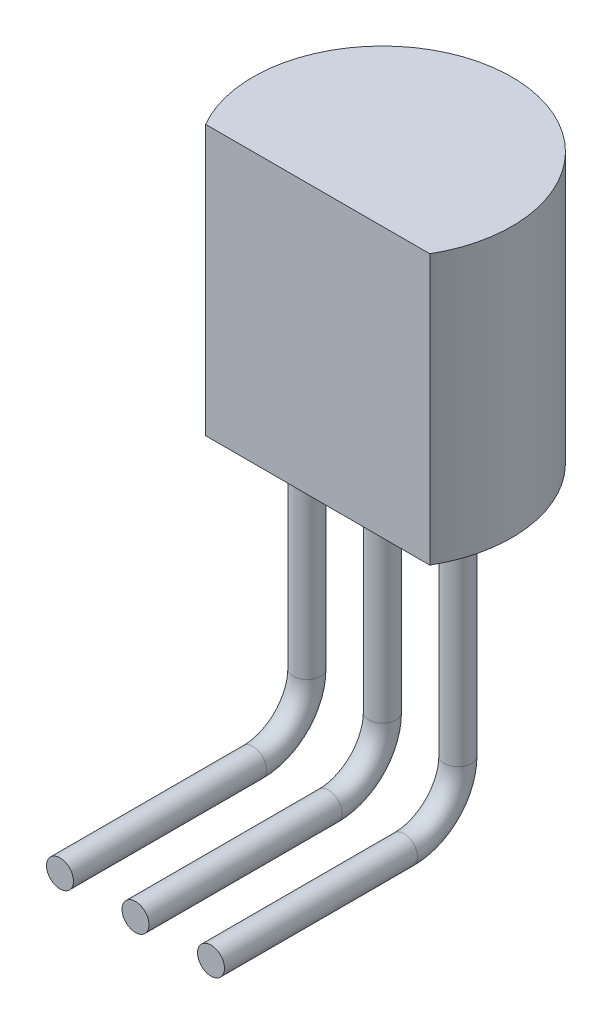
ISO-10303-21;
HEADER;
FILE_DESCRIPTION(('STEP AP214'),'2;1');
FILE_NAME('part.step','',(''),(''),'','','');
FILE_SCHEMA(('AUTOMOTIVE_DESIGN { 1 0 10303 214 1 1 1 1 }'));
ENDSEC;
DATA;
#1=APPLICATION_CONTEXT('core data for automotive mechanical design processes');
#2=APPLICATION_PROTOCOL_DEFINITION('international standard','automotive_design',2000,#1);
#3=PRODUCT_CONTEXT('',#1,'mechanical');
#4=PRODUCT('Part','Part','',(#3));
#5=PRODUCT_RELATED_PRODUCT_CATEGORY('part','',(#4));
#6=PRODUCT_DEFINITION_FORMATION('','',#4);
#7=PRODUCT_DEFINITION_CONTEXT('part definition',#1,'design');
#8=PRODUCT_DEFINITION('design','',#6,#7);
#9=PRODUCT_DEFINITION_SHAPE('','',#8);
#10=(LENGTH_UNIT() NAMED_UNIT(*) SI_UNIT(.MILLI.,.METRE.));
#11=(NAMED_UNIT(*) PLANE_ANGLE_UNIT() SI_UNIT($,.RADIAN.));
#12=(NAMED_UNIT(*) SI_UNIT($,.STERADIAN.) SOLID_ANGLE_UNIT());
#13=UNCERTAINTY_MEASURE_WITH_UNIT(LENGTH_MEASURE(1.E-05),#10,'distance_accuracy_value','');
#14=(GEOMETRIC_REPRESENTATION_CONTEXT(3) GLOBAL_UNCERTAINTY_ASSIGNED_CONTEXT((#13)) GLOBAL_UNIT_ASSIGNED_CONTEXT((#10,
#11,#12)) REPRESENTATION_CONTEXT('',''));
#15=CARTESIAN_POINT('',(0.,0.,0.));
#16=DIRECTION('',(0.,0.,1.));
#17=DIRECTION('',(1.,0.,0.));
#18=AXIS2_PLACEMENT_3D('',#15,#16,#17);
#19=CARTESIAN_POINT('',(0.,0.,0.));
#20=DIRECTION('',(0.,1.,0.));
#21=DIRECTION('',(0.,0.,1.));
#22=AXIS2_PLACEMENT_3D('',#19,#20,#21);
#23=PLANE('',#22);
#24=CARTESIAN_POINT('',(1.4,0.,0.));
#25=DIRECTION('',(0.,-1.,0.));
#26=DIRECTION('',(0.,0.,-1.));
#27=AXIS2_PLACEMENT_3D('',#24,#25,#26);
#28=CIRCLE('',#27,0.25);
#29=CARTESIAN_POINT('',(1.4,0.,-0.250000000000001));
#30=VERTEX_POINT('',#29);
#31=EDGE_CURVE('E41',#30,#30,#28,.T.);
#32=ORIENTED_EDGE('',*,*,#31,.F.);
#33=EDGE_LOOP('',(#32));
#34=FACE_BOUND('',#33,.T.);
#35=CARTESIAN_POINT('',(0.,0.,0.));
#36=DIRECTION('',(0.,1.,0.));
#37=DIRECTION('',(0.,0.,1.));
#38=AXIS2_PLACEMENT_3D('',#35,#36,#37);
#39=CIRCLE('',#38,2.4);
#40=CARTESIAN_POINT('',(2.07846096908265,0.,1.2));
#41=VERTEX_POINT('',#40);
#42=CARTESIAN_POINT('',(-2.07846096908265,0.,1.2));
#43=VERTEX_POINT('',#42);
#44=EDGE_CURVE('E63',#41,#43,#39,.T.);
#45=ORIENTED_EDGE('',*,*,#44,.F.);
#46=DIRECTION('',(1.,0.,0.));
#47=VECTOR('',#46,1.);
#48=CARTESIAN_POINT('',(-2.07846096908265,0.,1.2));
#49=LINE('',#48,#47);
#50=EDGE_CURVE('E60',#43,#41,#49,.T.);
#51=ORIENTED_EDGE('',*,*,#50,.F.);
#52=EDGE_LOOP('',(#45,#51));
#53=FACE_BOUND('',#52,.T.);
#54=CARTESIAN_POINT('',(0.,0.,0.));
#55=DIRECTION('',(0.,-1.,0.));
#56=DIRECTION('',(0.,0.,-1.));
#57=AXIS2_PLACEMENT_3D('',#54,#55,#56);
#58=CIRCLE('',#57,0.25);
#59=CARTESIAN_POINT('',(0.,0.,-0.25));
#60=VERTEX_POINT('',#59);
#61=EDGE_CURVE('E71',#60,#60,#58,.T.);
#62=ORIENTED_EDGE('',*,*,#61,.F.);
#63=EDGE_LOOP('',(#62));
#64=FACE_BOUND('',#63,.T.);
#65=CARTESIAN_POINT('',(-1.4,0.,0.));
#66=DIRECTION('',(0.,-1.,0.));
#67=DIRECTION('',(0.,0.,-1.));
#68=AXIS2_PLACEMENT_3D('',#65,#66,#67);
#69=CIRCLE('',#68,0.25);
#70=CARTESIAN_POINT('',(-1.4,0.,-0.250000000000001));
#71=VERTEX_POINT('',#70);
#72=EDGE_CURVE('E11',#71,#71,#69,.T.);
#73=ORIENTED_EDGE('',*,*,#72,.F.);
#74=EDGE_LOOP('',(#73));
#75=FACE_BOUND('',#74,.T.);
#76=ADVANCED_FACE('F32',(#34,#53,#64,#75),#23,.F.);
#77=CARTESIAN_POINT('',(0.,5.,0.));
#78=DIRECTION('',(0.,-1.,0.));
#79=DIRECTION('',(0.,0.,-1.));
#80=AXIS2_PLACEMENT_3D('',#77,#78,#79);
#81=CYLINDRICAL_SURFACE('',#80,2.4);
#82=ORIENTED_EDGE('',*,*,#44,.T.);
#83=DIRECTION('',(0.,-1.,0.));
#84=VECTOR('',#83,1.);
#85=CARTESIAN_POINT('',(-2.07846096908265,5.,1.2));
#86=LINE('',#85,#84);
#87=CARTESIAN_POINT('',(-2.07846096908265,5.,1.2));
#88=VERTEX_POINT('',#87);
#89=EDGE_CURVE('E36',#88,#43,#86,.T.);
#90=ORIENTED_EDGE('',*,*,#89,.F.);
#91=CARTESIAN_POINT('',(0.,5.,0.));
#92=DIRECTION('',(0.,1.,0.));
#93=DIRECTION('',(0.,0.,1.));
#94=AXIS2_PLACEMENT_3D('',#91,#92,#93);
#95=CIRCLE('',#94,2.4);
#96=CARTESIAN_POINT('',(2.07846096908265,5.,1.2));
#97=VERTEX_POINT('',#96);
#98=EDGE_CURVE('E65',#97,#88,#95,.T.);
#99=ORIENTED_EDGE('',*,*,#98,.F.);
#100=DIRECTION('',(0.,-1.,0.));
#101=VECTOR('',#100,1.);
#102=CARTESIAN_POINT('',(2.07846096908265,5.,1.2));
#103=LINE('',#102,#101);
#104=EDGE_CURVE('E72',#97,#41,#103,.T.);
#105=ORIENTED_EDGE('',*,*,#104,.T.);
#106=EDGE_LOOP('',(#82,#90,#99,#105));
#107=FACE_BOUND('',#106,.T.);
#108=ADVANCED_FACE('F34',(#107),#81,.T.);
#109=CARTESIAN_POINT('',(-2.07846096908265,5.,1.2));
#110=DIRECTION('',(0.,0.,-1.));
#111=DIRECTION('',(-1.,0.,0.));
#112=AXIS2_PLACEMENT_3D('',#109,#110,#111);
#113=PLANE('',#112);
#114=ORIENTED_EDGE('',*,*,#50,.T.);
#115=ORIENTED_EDGE('',*,*,#104,.F.);
#116=DIRECTION('',(1.,0.,0.));
#117=VECTOR('',#116,1.);
#118=CARTESIAN_POINT('',(-2.07846096908265,5.,1.2));
#119=LINE('',#118,#117);
#120=EDGE_CURVE('E48',#88,#97,#119,.T.);
#121=ORIENTED_EDGE('',*,*,#120,.F.);
#122=ORIENTED_EDGE('',*,*,#89,.T.);
#123=EDGE_LOOP('',(#114,#115,#121,#122));
#124=FACE_BOUND('',#123,.T.);
#125=ADVANCED_FACE('F68',(#124),#113,.F.);
#126=CARTESIAN_POINT('',(0.,5.,0.));
#127=DIRECTION('',(0.,1.,0.));
#128=DIRECTION('',(0.,0.,1.));
#129=AXIS2_PLACEMENT_3D('',#126,#127,#128);
#130=PLANE('',#129);
#131=ORIENTED_EDGE('',*,*,#98,.T.);
#132=ORIENTED_EDGE('',*,*,#120,.T.);
#133=EDGE_LOOP('',(#131,#132));
#134=FACE_BOUND('',#133,.T.);
#135=ADVANCED_FACE('F81',(#134),#130,.T.);
#136=CARTESIAN_POINT('',(0.,-4.99999999999997,1.00000000000001));
#137=DIRECTION('',(0.,0.,1.));
#138=DIRECTION('',(1.,0.,0.));
#139=AXIS2_PLACEMENT_3D('',#136,#137,#138);
#140=CYLINDRICAL_SURFACE('',#139,0.25);
#141=CARTESIAN_POINT('',(0.,-4.99999999999997,1.00000000000001));
#142=DIRECTION('',(0.,0.,1.));
#143=DIRECTION('',(0.,-1.,0.));
#144=AXIS2_PLACEMENT_3D('',#141,#142,#143);
#145=CIRCLE('',#144,0.25);
#146=CARTESIAN_POINT('',(0.,-5.24999999999997,1.00000000000001));
#147=VERTEX_POINT('',#146);
#148=EDGE_CURVE('E76',#147,#147,#145,.T.);
#149=ORIENTED_EDGE('',*,*,#148,.T.);
#150=EDGE_LOOP('',(#149));
#151=FACE_BOUND('',#150,.T.);
#152=CARTESIAN_POINT('',(0.,-4.99999999999997,4.57813022556657));
#153=DIRECTION('',(0.,0.,1.));
#154=DIRECTION('',(0.,-1.,0.));
#155=AXIS2_PLACEMENT_3D('',#152,#153,#154);
#156=CIRCLE('',#155,0.25);
#157=CARTESIAN_POINT('',(0.,-5.24999999999997,4.57813022556657));
#158=VERTEX_POINT('',#157);
#159=EDGE_CURVE('E73',#158,#158,#156,.T.);
#160=ORIENTED_EDGE('',*,*,#159,.F.);
#161=EDGE_LOOP('',(#160));
#162=FACE_BOUND('',#161,.T.);
#163=ADVANCED_FACE('F83',(#151,#162),#140,.T.);
#164=CARTESIAN_POINT('',(0.,-4.,1.));
#165=DIRECTION('',(-1.,0.,0.));
#166=DIRECTION('',(0.,0.,1.));
#167=AXIS2_PLACEMENT_3D('',#164,#165,#166);
#168=TOROIDAL_SURFACE('',#167,0.999999999999972,0.25);
#169=CARTESIAN_POINT('',(0.,-3.99999999999999,0.));
#170=DIRECTION('',(0.,-1.,0.));
#171=DIRECTION('',(0.,0.,-1.));
#172=AXIS2_PLACEMENT_3D('',#169,#170,#171);
#173=CIRCLE('',#172,0.25);
#174=CARTESIAN_POINT('',(0.,-3.99999999999999,-0.249999999999972));
#175=VERTEX_POINT('',#174);
#176=EDGE_CURVE('E165',#175,#175,#173,.T.);
#177=CARTESIAN_POINT('',(0.,-4.,1.));
#178=DIRECTION('',(-1.,0.,0.));
#179=DIRECTION('',(0.,0.,1.));
#180=AXIS2_PLACEMENT_3D('',#177,#178,#179);
#181=CIRCLE('',#180,1.24999999999997);
#182=EDGE_CURVE('',#175,#147,#181,.T.);
#183=ORIENTED_EDGE('',*,*,#176,.T.);
#184=ORIENTED_EDGE('',*,*,#148,.F.);
#185=ORIENTED_EDGE('',*,*,#182,.T.);
#186=ORIENTED_EDGE('',*,*,#182,.F.);
#187=EDGE_LOOP('',(#183,#185,#184,#186));
#188=FACE_BOUND('',#187,.T.);
#189=ADVANCED_FACE('F89',(#188),#168,.T.);
#190=CARTESIAN_POINT('',(0.,-3.99999999999999,0.));
#191=DIRECTION('',(0.,1.,0.));
#192=DIRECTION('',(0.,0.,1.));
#193=AXIS2_PLACEMENT_3D('',#190,#191,#192);
#194=CYLINDRICAL_SURFACE('',#193,0.25);
#195=ORIENTED_EDGE('',*,*,#176,.F.);
#196=EDGE_LOOP('',(#195));
#197=FACE_BOUND('',#196,.T.);
#198=ORIENTED_EDGE('',*,*,#61,.T.);
#199=EDGE_LOOP('',(#198));
#200=FACE_BOUND('',#199,.T.);
#201=ADVANCED_FACE('F102',(#197,#200),#194,.T.);
#202=CARTESIAN_POINT('',(0.,-4.99999999999997,4.57813022556657));
#203=DIRECTION('',(0.,0.,1.));
#204=DIRECTION('',(0.,-1.,0.));
#205=AXIS2_PLACEMENT_3D('',#202,#203,#204);
#206=PLANE('',#205);
#207=ORIENTED_EDGE('',*,*,#159,.T.);
#208=EDGE_LOOP('',(#207));
#209=FACE_BOUND('',#208,.T.);
#210=ADVANCED_FACE('F106',(#209),#206,.T.);
#211=CARTESIAN_POINT('',(1.4,-4.99999999999997,1.00000000000001));
#212=DIRECTION('',(0.,0.,1.));
#213=DIRECTION('',(1.,0.,0.));
#214=AXIS2_PLACEMENT_3D('',#211,#212,#213);
#215=CYLINDRICAL_SURFACE('',#214,0.25);
#216=CARTESIAN_POINT('',(1.4,-4.99999999999997,1.00000000000001));
#217=DIRECTION('',(0.,0.,1.));
#218=DIRECTION('',(0.,-1.,0.));
#219=AXIS2_PLACEMENT_3D('',#216,#217,#218);
#220=CIRCLE('',#219,0.25);
#221=CARTESIAN_POINT('',(1.4,-5.24999999999997,1.00000000000001));
#222=VERTEX_POINT('',#221);
#223=EDGE_CURVE('E152',#222,#222,#220,.T.);
#224=ORIENTED_EDGE('',*,*,#223,.T.);
#225=EDGE_LOOP('',(#224));
#226=FACE_BOUND('',#225,.T.);
#227=CARTESIAN_POINT('',(1.4,-4.99999999999997,4.57813022556657));
#228=DIRECTION('',(0.,0.,1.));
#229=DIRECTION('',(0.,-1.,0.));
#230=AXIS2_PLACEMENT_3D('',#227,#228,#229);
#231=CIRCLE('',#230,0.25);
#232=CARTESIAN_POINT('',(1.4,-5.24999999999997,4.57813022556657));
#233=VERTEX_POINT('',#232);
#234=EDGE_CURVE('E162',#233,#233,#231,.T.);
#235=ORIENTED_EDGE('',*,*,#234,.F.);
#236=EDGE_LOOP('',(#235));
#237=FACE_BOUND('',#236,.T.);
#238=ADVANCED_FACE('F110',(#226,#237),#215,.T.);
#239=CARTESIAN_POINT('',(1.4,-4.,1.));
#240=DIRECTION('',(-1.,0.,0.));
#241=DIRECTION('',(0.,0.,1.));
#242=AXIS2_PLACEMENT_3D('',#239,#240,#241);
#243=TOROIDAL_SURFACE('',#242,0.999999999999973,0.25);
#244=CARTESIAN_POINT('',(1.4,-3.99999999999999,0.));
#245=DIRECTION('',(0.,-1.,0.));
#246=DIRECTION('',(0.,0.,-1.));
#247=AXIS2_PLACEMENT_3D('',#244,#245,#246);
#248=CIRCLE('',#247,0.25);
#249=CARTESIAN_POINT('',(1.4,-3.99999999999999,-0.249999999999973));
#250=VERTEX_POINT('',#249);
#251=EDGE_CURVE('E148',#250,#250,#248,.T.);
#252=CARTESIAN_POINT('',(1.4,-4.,1.));
#253=DIRECTION('',(-1.,0.,0.));
#254=DIRECTION('',(0.,0.,1.));
#255=AXIS2_PLACEMENT_3D('',#252,#253,#254);
#256=CIRCLE('',#255,1.24999999999997);
#257=EDGE_CURVE('',#250,#222,#256,.T.);
#258=ORIENTED_EDGE('',*,*,#251,.T.);
#259=ORIENTED_EDGE('',*,*,#223,.F.);
#260=ORIENTED_EDGE('',*,*,#257,.T.);
#261=ORIENTED_EDGE('',*,*,#257,.F.);
#262=EDGE_LOOP('',(#258,#260,#259,#261));
#263=FACE_BOUND('',#262,.T.);
#264=ADVANCED_FACE('F114',(#263),#243,.T.);
#265=CARTESIAN_POINT('',(1.4,-3.99999999999999,0.));
#266=DIRECTION('',(0.,1.,0.));
#267=DIRECTION('',(0.,0.,1.));
#268=AXIS2_PLACEMENT_3D('',#265,#266,#267);
#269=CYLINDRICAL_SURFACE('',#268,0.25);
#270=ORIENTED_EDGE('',*,*,#251,.F.);
#271=EDGE_LOOP('',(#270));
#272=FACE_BOUND('',#271,.T.);
#273=ORIENTED_EDGE('',*,*,#31,.T.);
#274=EDGE_LOOP('',(#273));
#275=FACE_BOUND('',#274,.T.);
#276=ADVANCED_FACE('F118',(#272,#275),#269,.T.);
#277=CARTESIAN_POINT('',(1.4,-4.99999999999997,4.57813022556657));
#278=DIRECTION('',(0.,0.,1.));
#279=DIRECTION('',(0.,-1.,0.));
#280=AXIS2_PLACEMENT_3D('',#277,#278,#279);
#281=PLANE('',#280);
#282=ORIENTED_EDGE('',*,*,#234,.T.);
#283=EDGE_LOOP('',(#282));
#284=FACE_BOUND('',#283,.T.);
#285=ADVANCED_FACE('F122',(#284),#281,.T.);
#286=CARTESIAN_POINT('',(-1.4,-4.99999999999997,1.00000000000001));
#287=DIRECTION('',(0.,0.,1.));
#288=DIRECTION('',(1.,0.,0.));
#289=AXIS2_PLACEMENT_3D('',#286,#287,#288);
#290=CYLINDRICAL_SURFACE('',#289,0.25);
#291=CARTESIAN_POINT('',(-1.4,-4.99999999999997,1.00000000000001));
#292=DIRECTION('',(0.,0.,1.));
#293=DIRECTION('',(0.,-1.,0.));
#294=AXIS2_PLACEMENT_3D('',#291,#292,#293);
#295=CIRCLE('',#294,0.25);
#296=CARTESIAN_POINT('',(-1.4,-5.24999999999997,1.00000000000001));
#297=VERTEX_POINT('',#296);
#298=EDGE_CURVE('E149',#297,#297,#295,.T.);
#299=ORIENTED_EDGE('',*,*,#298,.T.);
#300=EDGE_LOOP('',(#299));
#301=FACE_BOUND('',#300,.T.);
#302=CARTESIAN_POINT('',(-1.4,-4.99999999999997,4.57813022556657));
#303=DIRECTION('',(0.,0.,1.));
#304=DIRECTION('',(0.,-1.,0.));
#305=AXIS2_PLACEMENT_3D('',#302,#303,#304);
#306=CIRCLE('',#305,0.25);
#307=CARTESIAN_POINT('',(-1.4,-5.24999999999997,4.57813022556657));
#308=VERTEX_POINT('',#307);
#309=EDGE_CURVE('E146',#308,#308,#306,.T.);
#310=ORIENTED_EDGE('',*,*,#309,.F.);
#311=EDGE_LOOP('',(#310));
#312=FACE_BOUND('',#311,.T.);
#313=ADVANCED_FACE('F126',(#301,#312),#290,.T.);
#314=CARTESIAN_POINT('',(-1.4,-4.,1.));
#315=DIRECTION('',(-1.,0.,0.));
#316=DIRECTION('',(0.,0.,1.));
#317=AXIS2_PLACEMENT_3D('',#314,#315,#316);
#318=TOROIDAL_SURFACE('',#317,0.999999999999973,0.25);
#319=CARTESIAN_POINT('',(-1.4,-3.99999999999999,0.));
#320=DIRECTION('',(0.,-1.,0.));
#321=DIRECTION('',(0.,0.,-1.));
#322=AXIS2_PLACEMENT_3D('',#319,#320,#321);
#323=CIRCLE('',#322,0.25);
#324=CARTESIAN_POINT('',(-1.4,-3.99999999999999,-0.249999999999973));
#325=VERTEX_POINT('',#324);
#326=EDGE_CURVE('E155',#325,#325,#323,.T.);
#327=CARTESIAN_POINT('',(-1.4,-4.,1.));
#328=DIRECTION('',(-1.,0.,0.));
#329=DIRECTION('',(0.,0.,1.));
#330=AXIS2_PLACEMENT_3D('',#327,#328,#329);
#331=CIRCLE('',#330,1.24999999999997);
#332=EDGE_CURVE('',#325,#297,#331,.T.);
#333=ORIENTED_EDGE('',*,*,#326,.T.);
#334=ORIENTED_EDGE('',*,*,#298,.F.);
#335=ORIENTED_EDGE('',*,*,#332,.T.);
#336=ORIENTED_EDGE('',*,*,#332,.F.);
#337=EDGE_LOOP('',(#333,#335,#334,#336));
#338=FACE_BOUND('',#337,.T.);
#339=ADVANCED_FACE('F130',(#338),#318,.T.);
#340=CARTESIAN_POINT('',(-1.4,-3.99999999999999,0.));
#341=DIRECTION('',(0.,1.,0.));
#342=DIRECTION('',(0.,0.,1.));
#343=AXIS2_PLACEMENT_3D('',#340,#341,#342);
#344=CYLINDRICAL_SURFACE('',#343,0.25);
#345=ORIENTED_EDGE('',*,*,#326,.F.);
#346=EDGE_LOOP('',(#345));
#347=FACE_BOUND('',#346,.T.);
#348=ORIENTED_EDGE('',*,*,#72,.T.);
#349=EDGE_LOOP('',(#348));
#350=FACE_BOUND('',#349,.T.);
#351=ADVANCED_FACE('F134',(#347,#350),#344,.T.);
#352=CARTESIAN_POINT('',(-1.4,-4.99999999999997,4.57813022556657));
#353=DIRECTION('',(0.,0.,1.));
#354=DIRECTION('',(0.,-1.,0.));
#355=AXIS2_PLACEMENT_3D('',#352,#353,#354);
#356=PLANE('',#355);
#357=ORIENTED_EDGE('',*,*,#309,.T.);
#358=EDGE_LOOP('',(#357));
#359=FACE_BOUND('',#358,.T.);
#360=ADVANCED_FACE('F138',(#359),#356,.T.);
#361=CLOSED_SHELL('',(#76,#108,#125,#135,#163,#189,#201,#210,#238,#264,#276,#285,#313,#339,#351,#360));
#362=MANIFOLD_SOLID_BREP('B2',#361);
#363=ADVANCED_BREP_SHAPE_REPRESENTATION('',(#18,#362),#14);
#364=SHAPE_DEFINITION_REPRESENTATION(#9,#363);
ENDSEC;
END-ISO-10303-21;
